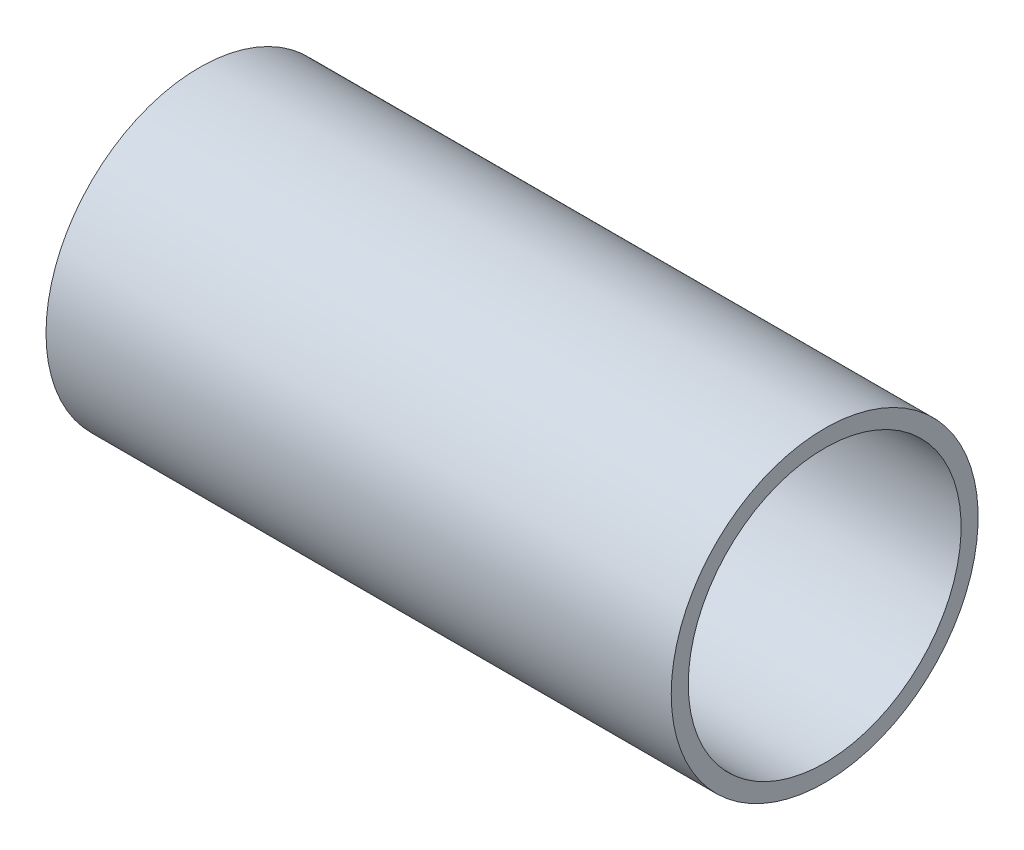
ISO-10303-21;
HEADER;
FILE_DESCRIPTION(('STEP AP214'),'2;1');
FILE_NAME('part.step','',(''),(''),'','','');
FILE_SCHEMA(('AUTOMOTIVE_DESIGN { 1 0 10303 214 1 1 1 1 }'));
ENDSEC;
DATA;
#1=APPLICATION_CONTEXT('core data for automotive mechanical design processes');
#2=APPLICATION_PROTOCOL_DEFINITION('international standard','automotive_design',2000,#1);
#3=PRODUCT_CONTEXT('',#1,'mechanical');
#4=PRODUCT('Part','Part','',(#3));
#5=PRODUCT_RELATED_PRODUCT_CATEGORY('part','',(#4));
#6=PRODUCT_DEFINITION_FORMATION('','',#4);
#7=PRODUCT_DEFINITION_CONTEXT('part definition',#1,'design');
#8=PRODUCT_DEFINITION('design','',#6,#7);
#9=PRODUCT_DEFINITION_SHAPE('','',#8);
#10=(LENGTH_UNIT() NAMED_UNIT(*) SI_UNIT(.MILLI.,.METRE.));
#11=(NAMED_UNIT(*) PLANE_ANGLE_UNIT() SI_UNIT($,.RADIAN.));
#12=(NAMED_UNIT(*) SI_UNIT($,.STERADIAN.) SOLID_ANGLE_UNIT());
#13=UNCERTAINTY_MEASURE_WITH_UNIT(LENGTH_MEASURE(1.E-05),#10,'distance_accuracy_value','');
#14=(GEOMETRIC_REPRESENTATION_CONTEXT(3) GLOBAL_UNCERTAINTY_ASSIGNED_CONTEXT((#13)) GLOBAL_UNIT_ASSIGNED_CONTEXT((#10,
#11,#12)) REPRESENTATION_CONTEXT('',''));
#15=CARTESIAN_POINT('',(0.,0.,0.));
#16=DIRECTION('',(0.,0.,1.));
#17=DIRECTION('',(1.,0.,0.));
#18=AXIS2_PLACEMENT_3D('',#15,#16,#17);
#19=CARTESIAN_POINT('',(25.7,27.,0.));
#20=DIRECTION('',(1.,0.,0.));
#21=DIRECTION('',(0.,0.,-1.));
#22=AXIS2_PLACEMENT_3D('',#19,#20,#21);
#23=PLANE('',#22);
#24=CARTESIAN_POINT('',(25.7,0.,0.));
#25=DIRECTION('',(-1.,0.,0.));
#26=DIRECTION('',(0.,0.,1.));
#27=AXIS2_PLACEMENT_3D('',#24,#25,#26);
#28=CIRCLE('',#27,24.);
#29=CARTESIAN_POINT('',(25.7,0.,24.));
#30=VERTEX_POINT('',#29);
#31=EDGE_CURVE('E10',#30,#30,#28,.T.);
#32=ORIENTED_EDGE('',*,*,#31,.F.);
#33=EDGE_LOOP('',(#32));
#34=FACE_BOUND('',#33,.T.);
#35=CARTESIAN_POINT('',(25.7,0.,0.));
#36=DIRECTION('',(-1.,0.,0.));
#37=DIRECTION('',(0.,0.,1.));
#38=AXIS2_PLACEMENT_3D('',#35,#36,#37);
#39=CIRCLE('',#38,27.);
#40=CARTESIAN_POINT('',(25.7,0.,27.));
#41=VERTEX_POINT('',#40);
#42=EDGE_CURVE('E54',#41,#41,#39,.T.);
#43=ORIENTED_EDGE('',*,*,#42,.T.);
#44=EDGE_LOOP('',(#43));
#45=FACE_BOUND('',#44,.T.);
#46=ADVANCED_FACE('F37',(#34,#45),#23,.F.);
#47=CARTESIAN_POINT('',(-110.,0.,0.));
#48=DIRECTION('',(-1.,0.,0.));
#49=DIRECTION('',(0.,0.,1.));
#50=AXIS2_PLACEMENT_3D('',#47,#48,#49);
#51=CYLINDRICAL_SURFACE('',#50,24.);
#52=CARTESIAN_POINT('',(135.7,0.,0.));
#53=DIRECTION('',(-1.,0.,0.));
#54=DIRECTION('',(0.,0.,1.));
#55=AXIS2_PLACEMENT_3D('',#52,#53,#54);
#56=CIRCLE('',#55,24.);
#57=CARTESIAN_POINT('',(135.7,0.,24.));
#58=VERTEX_POINT('',#57);
#59=EDGE_CURVE('E44',#58,#58,#56,.T.);
#60=ORIENTED_EDGE('',*,*,#59,.F.);
#61=EDGE_LOOP('',(#60));
#62=FACE_BOUND('',#61,.T.);
#63=ORIENTED_EDGE('',*,*,#31,.T.);
#64=EDGE_LOOP('',(#63));
#65=FACE_BOUND('',#64,.T.);
#66=ADVANCED_FACE('F70',(#62,#65),#51,.F.);
#67=CARTESIAN_POINT('',(135.7,24.,0.));
#68=DIRECTION('',(-1.,0.,0.));
#69=DIRECTION('',(0.,0.,1.));
#70=AXIS2_PLACEMENT_3D('',#67,#68,#69);
#71=PLANE('',#70);
#72=CARTESIAN_POINT('',(135.7,0.,0.));
#73=DIRECTION('',(-1.,0.,0.));
#74=DIRECTION('',(0.,0.,1.));
#75=AXIS2_PLACEMENT_3D('',#72,#73,#74);
#76=CIRCLE('',#75,27.);
#77=CARTESIAN_POINT('',(135.7,0.,27.));
#78=VERTEX_POINT('',#77);
#79=EDGE_CURVE('E49',#78,#78,#76,.T.);
#80=ORIENTED_EDGE('',*,*,#79,.F.);
#81=EDGE_LOOP('',(#80));
#82=FACE_BOUND('',#81,.T.);
#83=ORIENTED_EDGE('',*,*,#59,.T.);
#84=EDGE_LOOP('',(#83));
#85=FACE_BOUND('',#84,.T.);
#86=ADVANCED_FACE('F65',(#82,#85),#71,.F.);
#87=CARTESIAN_POINT('',(-110.,0.,0.));
#88=DIRECTION('',(-1.,0.,0.));
#89=DIRECTION('',(0.,0.,1.));
#90=AXIS2_PLACEMENT_3D('',#87,#88,#89);
#91=CYLINDRICAL_SURFACE('',#90,27.);
#92=ORIENTED_EDGE('',*,*,#42,.F.);
#93=EDGE_LOOP('',(#92));
#94=FACE_BOUND('',#93,.T.);
#95=ORIENTED_EDGE('',*,*,#79,.T.);
#96=EDGE_LOOP('',(#95));
#97=FACE_BOUND('',#96,.T.);
#98=ADVANCED_FACE('F62',(#94,#97),#91,.T.);
#99=CLOSED_SHELL('',(#46,#66,#86,#98));
#100=MANIFOLD_SOLID_BREP('B2',#99);
#101=ADVANCED_BREP_SHAPE_REPRESENTATION('',(#18,#100),#14);
#102=SHAPE_DEFINITION_REPRESENTATION(#9,#101);
ENDSEC;
END-ISO-10303-21;
